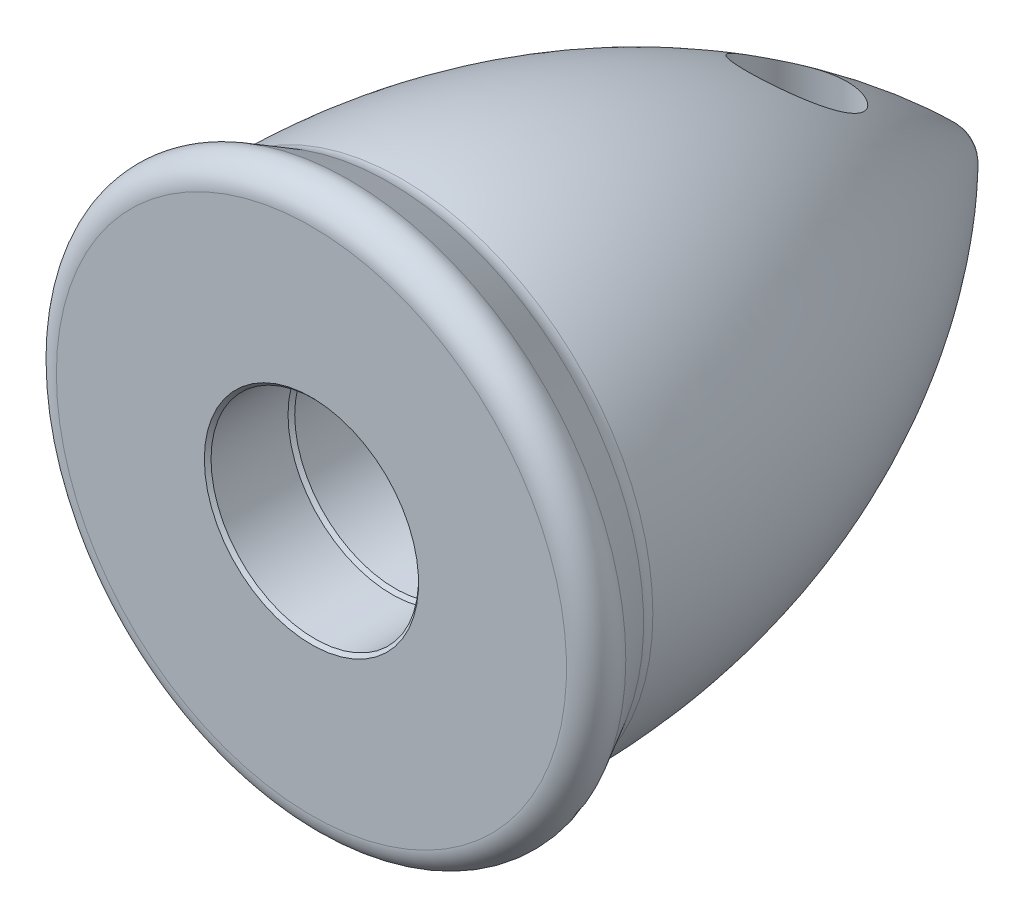
ISO-10303-21;
HEADER;
FILE_DESCRIPTION(('STEP AP214'),'2;1');
FILE_NAME('part.step','',(''),(''),'','','');
FILE_SCHEMA(('AUTOMOTIVE_DESIGN { 1 0 10303 214 1 1 1 1 }'));
ENDSEC;
DATA;
#1=APPLICATION_CONTEXT('core data for automotive mechanical design processes');
#2=APPLICATION_PROTOCOL_DEFINITION('international standard','automotive_design',2000,#1);
#3=PRODUCT_CONTEXT('',#1,'mechanical');
#4=PRODUCT('Part','Part','',(#3));
#5=PRODUCT_RELATED_PRODUCT_CATEGORY('part','',(#4));
#6=PRODUCT_DEFINITION_FORMATION('','',#4);
#7=PRODUCT_DEFINITION_CONTEXT('part definition',#1,'design');
#8=PRODUCT_DEFINITION('design','',#6,#7);
#9=PRODUCT_DEFINITION_SHAPE('','',#8);
#10=(LENGTH_UNIT() NAMED_UNIT(*) SI_UNIT(.MILLI.,.METRE.));
#11=(NAMED_UNIT(*) PLANE_ANGLE_UNIT() SI_UNIT($,.RADIAN.));
#12=(NAMED_UNIT(*) SI_UNIT($,.STERADIAN.) SOLID_ANGLE_UNIT());
#13=UNCERTAINTY_MEASURE_WITH_UNIT(LENGTH_MEASURE(1.E-05),#10,'distance_accuracy_value','');
#14=(GEOMETRIC_REPRESENTATION_CONTEXT(3) GLOBAL_UNCERTAINTY_ASSIGNED_CONTEXT((#13)) GLOBAL_UNIT_ASSIGNED_CONTEXT((#10,
#11,#12)) REPRESENTATION_CONTEXT('',''));
#15=CARTESIAN_POINT('',(0.,0.,0.));
#16=DIRECTION('',(0.,0.,1.));
#17=DIRECTION('',(1.,0.,0.));
#18=AXIS2_PLACEMENT_3D('',#15,#16,#17);
#19=CARTESIAN_POINT('',(7.50239386398377,0.,-2.29469548189932));
#20=CARTESIAN_POINT('',(7.5297305454616,0.,-5.74779549459788));
#21=CARTESIAN_POINT('',(6.1833923831177,0.,-11.7594867084584));
#22=CARTESIAN_POINT('',(2.67653979166486,0.,-16.7942215413426));
#23=CARTESIAN_POINT('',(0.7143215008139,0.,-18.7971070681359));
#24=B_SPLINE_CURVE_WITH_KNOTS('',3,(#19,#20,#21,#22,#23),.UNSPECIFIED.,.F.,.F.,(4,1,4),
(0.00980925829120195,0.525019897301883,0.949749030526497),.UNSPECIFIED.);
#25=CARTESIAN_POINT('',(0.,0.,-16.7519899261462));
#26=DIRECTION('',(0.,0.,-1.));
#27=AXIS1_PLACEMENT('',#25,#26);
#28=SURFACE_OF_REVOLUTION('',#24,#27);
#29=CARTESIAN_POINT('',(0.,0.,-18.7971070681359));
#30=DIRECTION('',(0.,0.,-1.));
#31=DIRECTION('',(-1.,0.,0.));
#32=AXIS2_PLACEMENT_3D('',#29,#30,#31);
#33=CIRCLE('',#32,0.714321500813902);
#34=CARTESIAN_POINT('',(-0.714321500813902,0.,-18.7971070681359));
#35=VERTEX_POINT('',#34);
#36=EDGE_CURVE('E52',#35,#35,#33,.T.);
#37=ORIENTED_EDGE('',*,*,#36,.F.);
#38=EDGE_LOOP('',(#37));
#39=FACE_BOUND('',#38,.T.);
#40=CARTESIAN_POINT('',(0.,0.,-2.29469548189932));
#41=DIRECTION('',(0.,0.,-1.));
#42=DIRECTION('',(-1.,0.,0.));
#43=AXIS2_PLACEMENT_3D('',#40,#41,#42);
#44=CIRCLE('',#43,7.50239386398377);
#45=CARTESIAN_POINT('',(-7.50239386398377,0.,-2.29469548189932));
#46=VERTEX_POINT('',#45);
#47=EDGE_CURVE('E11',#46,#46,#44,.T.);
#48=ORIENTED_EDGE('',*,*,#47,.T.);
#49=EDGE_LOOP('',(#48));
#50=FACE_BOUND('',#49,.T.);
#51=CARTESIAN_POINT('',(0.,-3.36683611529871,-15.5972893877669));
#52=CARTESIAN_POINT('',(0.0812272409601651,-3.36683418529455,-15.5972855620368));
#53=CARTESIAN_POINT('',(0.162550375921565,-3.36846590658514,-15.5906634564938));
#54=CARTESIAN_POINT('',(0.323019432340645,-3.37521289617,-15.5643581949395));
#55=CARTESIAN_POINT('',(0.402160903985751,-3.38033480462186,-15.5446501444629));
#56=CARTESIAN_POINT('',(0.555887105832765,-3.39465908735613,-15.4928398181126));
#57=CARTESIAN_POINT('',(0.630472857133166,-3.40386054342055,-15.4607403314935));
#58=CARTESIAN_POINT('',(0.772882458401085,-3.42709325176989,-15.3853651492674));
#59=CARTESIAN_POINT('',(0.840710646777201,-3.44112137918871,-15.3420966891527));
#60=CARTESIAN_POINT('',(0.967260164628035,-3.47450541452666,-15.2464833314251));
#61=CARTESIAN_POINT('',(1.02605003179194,-3.49381778591244,-15.1942138435054));
#62=CARTESIAN_POINT('',(1.13380288913027,-3.53804914952354,-15.0824397100203));
#63=CARTESIAN_POINT('',(1.18276467042041,-3.56296883066632,-15.0229341758432));
#64=CARTESIAN_POINT('',(1.27095105138096,-3.61868115384143,-14.8977041099588));
#65=CARTESIAN_POINT('',(1.30997078630352,-3.64957731175465,-14.8318821564998));
#66=CARTESIAN_POINT('',(1.37689927932686,-3.71620795594519,-14.6971363118445));
#67=CARTESIAN_POINT('',(1.40480332361975,-3.75194448627936,-14.6282111184247));
#68=CARTESIAN_POINT('',(1.45220607846086,-3.83133313156455,-14.481550041618));
#69=CARTESIAN_POINT('',(1.47048669816308,-3.87542305239418,-14.4036602279141));
#70=CARTESIAN_POINT('',(1.49449396126122,-3.96698573065123,-14.2479631341415));
#71=CARTESIAN_POINT('',(1.50021431061989,-4.01446017178838,-14.1701559149716));
#72=CARTESIAN_POINT('',(1.49973589985453,-4.11977607227993,-14.0027065344512));
#73=CARTESIAN_POINT('',(1.49133625746062,-4.1780040131553,-13.9133109171399));
#74=CARTESIAN_POINT('',(1.45904796325544,-4.29537958061144,-13.7379143236744));
#75=CARTESIAN_POINT('',(1.4351411335718,-4.35452820691995,-13.6519174572879));
#76=CARTESIAN_POINT('',(1.36830129598194,-4.47904620022881,-13.4745661923774));
#77=CARTESIAN_POINT('',(1.32339850886644,-4.54429137333329,-13.3838433939071));
#78=CARTESIAN_POINT('',(1.24191426663574,-4.63885556808259,-13.2545309878723));
#79=CARTESIAN_POINT('',(1.21241100033431,-4.66981582259914,-13.212569370427));
#80=CARTESIAN_POINT('',(1.14862215835048,-4.73029377008918,-13.1311926843234));
#81=CARTESIAN_POINT('',(1.11433073125292,-4.75980963741857,-13.0917808191743));
#82=CARTESIAN_POINT('',(1.02421671800585,-4.82993934844167,-12.9987078322162));
#83=CARTESIAN_POINT('',(0.965716097720881,-4.86946064794607,-12.9467658739084));
#84=CARTESIAN_POINT('',(0.838999079217955,-4.94252978294202,-12.8513564941756));
#85=CARTESIAN_POINT('',(0.770802072466016,-4.97608924702086,-12.8078725592503));
#86=CARTESIAN_POINT('',(0.637390109006207,-5.03048040389518,-12.7377114459668));
#87=CARTESIAN_POINT('',(0.573495908020763,-5.05249460600546,-12.7094507912064));
#88=CARTESIAN_POINT('',(0.44061752935313,-5.08975973634557,-12.6617303727366));
#89=CARTESIAN_POINT('',(0.371635837598982,-5.10501394254217,-12.6422663433942));
#90=CARTESIAN_POINT('',(0.229968220063427,-5.12777874095686,-12.6132525851542));
#91=CARTESIAN_POINT('',(0.157265162131024,-5.13524935241915,-12.6037540426697));
#92=CARTESIAN_POINT('',(0.010881157996371,-5.14170815273184,-12.5955406143506));
#93=CARTESIAN_POINT('',(-0.062799474423151,-5.14069900066183,-12.5968223480431));
#94=CARTESIAN_POINT('',(-0.202136393767585,-5.13075544653971,-12.6094711461916));
#95=CARTESIAN_POINT('',(-0.267928679632418,-5.12252556026103,-12.6199416933949));
#96=CARTESIAN_POINT('',(-0.396472546982742,-5.09963335861077,-12.6491335116116));
#97=CARTESIAN_POINT('',(-0.459223775702315,-5.08497029895804,-12.6678557372977));
#98=CARTESIAN_POINT('',(-0.582708946967991,-5.04936235558407,-12.713471758756));
#99=CARTESIAN_POINT('',(-0.643271711223776,-5.02819698030078,-12.7406528995982));
#100=CARTESIAN_POINT('',(-0.758782287827659,-4.98086929586297,-12.8017108180393));
#101=CARTESIAN_POINT('',(-0.813727690608846,-4.95470485605077,-12.8355904508262));
#102=CARTESIAN_POINT('',(-0.925658259684589,-4.89397422367666,-12.9146814199054));
#103=CARTESIAN_POINT('',(-0.981607410812035,-4.85873386027955,-12.9608368210213));
#104=CARTESIAN_POINT('',(-1.08503586507779,-4.78432157249232,-13.0591188366811));
#105=CARTESIAN_POINT('',(-1.13250544901166,-4.74514521601259,-13.1112521921927));
#106=CARTESIAN_POINT('',(-1.22795052232634,-4.65555114198199,-13.2317163771232));
#107=CARTESIAN_POINT('',(-1.27394086126101,-4.60449987484057,-13.3011501864998));
#108=CARTESIAN_POINT('',(-1.35340655440566,-4.50017828314449,-13.4453106143892));
#109=CARTESIAN_POINT('',(-1.38687270302636,-4.44690635818978,-13.520041078276));
#110=CARTESIAN_POINT('',(-1.4460678811299,-4.33004840960501,-13.6872893245782));
#111=CARTESIAN_POINT('',(-1.46933444239801,-4.26632537576646,-13.7805942135521));
#112=CARTESIAN_POINT('',(-1.49777248921709,-4.14027225832051,-13.9709534484073));
#113=CARTESIAN_POINT('',(-1.50292519762401,-4.07794368668011,-14.0680115796943));
#114=CARTESIAN_POINT('',(-1.49374868530631,-3.95471042865673,-14.2678435930831));
#115=CARTESIAN_POINT('',(-1.47862327080246,-3.89396522925433,-14.37068990071));
#116=CARTESIAN_POINT('',(-1.43913052995289,-3.80847646621682,-14.5235187524778));
#117=CARTESIAN_POINT('',(-1.42317627710231,-3.78092932354624,-14.5741995083119));
#118=CARTESIAN_POINT('',(-1.38550960550279,-3.72805078841556,-14.674553663076));
#119=CARTESIAN_POINT('',(-1.36379987117426,-3.70271837028919,-14.7242275200379));
#120=CARTESIAN_POINT('',(-1.30409481861067,-3.64446732670798,-14.8425262305979));
#121=CARTESIAN_POINT('',(-1.26309214677888,-3.6128518643145,-14.9103135352416));
#122=CARTESIAN_POINT('',(-1.16942899467661,-3.55562051666033,-15.0400673168667));
#123=CARTESIAN_POINT('',(-1.11677759953109,-3.52999998767151,-15.1020382768047));
#124=CARTESIAN_POINT('',(-1.00057203679875,-3.48490403069105,-15.2178241428651));
#125=CARTESIAN_POINT('',(-0.93698763063423,-3.46544608312833,-15.2716156270938));
#126=CARTESIAN_POINT('',(-0.800689845344788,-3.43240974312407,-15.368464528688));
#127=CARTESIAN_POINT('',(-0.727971144660849,-3.41883479875213,-15.4115156447932));
#128=CARTESIAN_POINT('',(-0.579547716424519,-3.39734976004411,-15.4831392965126));
#129=CARTESIAN_POINT('',(-0.504174650815422,-3.38919012393694,-15.5123286922207));
#130=CARTESIAN_POINT('',(-0.34952556142046,-3.37675813099057,-15.5582187921846));
#131=CARTESIAN_POINT('',(-0.270257451606524,-3.37247820973797,-15.5749437873306));
#132=CARTESIAN_POINT('',(-0.158674263387871,-3.36886081965983,-15.5892134767772));
#133=CARTESIAN_POINT('',(-0.127024287573077,-3.36810000848527,-15.5922392231327));
#134=CARTESIAN_POINT('',(-0.0635877747597487,-3.36708803209331,-15.5962779355057));
#135=CARTESIAN_POINT('',(-0.031801236681284,-3.36683687091368,-15.5972908855766));
#136=CARTESIAN_POINT('',(0.,-3.36683611529871,-15.5972893877669));
#137=B_SPLINE_CURVE_WITH_KNOTS('',3,(#51,#52,#53,#54,#55,#56,#57,#58,#59,#60,#61,#62,#63,#64,
#65,#66,#67,#68,#69,#70,#71,#72,#73,#74,#75,#76,#77,#78,#79,#80,#81,#82,#83,#84,#85,#86,#87,#88,
#89,#90,#91,#92,#93,#94,#95,#96,#97,#98,#99,#100,#101,#102,#103,#104,#105,#106,#107,#108,#109,
#110,#111,#112,#113,#114,#115,#116,#117,#118,#119,#120,#121,#122,#123,#124,#125,#126,#127,#128,
#129,#130,#131,#132,#133,#134,#135,#136),.UNSPECIFIED.,.T.,.F.,(4,2,2,2,2,2,2,2,2,2,2,2,2,2,2,2,
2,2,2,2,2,2,2,2,2,2,2,2,2,2,2,2,2,2,2,2,2,2,2,2,2,2,4),(0.,0.243563303916712,0.487591290904557,
0.731564380328201,0.975379813863515,1.21724399984576,1.45913791764857,1.70567331657026,
1.95231315223458,2.22533052638554,2.49848468021453,2.81825852793494,3.1384079007938,
3.49772269316163,3.67725090391433,3.85700046079829,4.11889511252797,4.38027319068593,
4.59911590574088,4.81785238608739,5.03770695788248,5.25749259037551,5.45795664682871,
5.65844390193861,5.86666453565482,6.07497411412518,6.31601442144172,6.55732925862869,
6.84929514324032,7.14147521044902,7.48603304697213,7.83094795316268,8.18980979435902,
8.36908223586731,8.54827120937681,8.80299009269337,9.05751101047158,9.31274755262736,
9.56813348906224,9.81073609628413,10.0528646690771,10.148221261502,10.2435786093962),.UNSPECIFIED.);
#138=CARTESIAN_POINT('',(0.,-3.36683611529871,-15.5972893877669));
#139=VERTEX_POINT('',#138);
#140=EDGE_CURVE('E103',#139,#139,#137,.T.);
#141=ORIENTED_EDGE('',*,*,#140,.F.);
#142=EDGE_LOOP('',(#141));
#143=FACE_BOUND('',#142,.T.);
#144=CARTESIAN_POINT('',(0.,3.36683611529871,-15.5972893877669));
#145=CARTESIAN_POINT('',(-0.0812272409601656,3.36683418529455,-15.5972855620368));
#146=CARTESIAN_POINT('',(-0.162550375921565,3.36846590658514,-15.5906634564937));
#147=CARTESIAN_POINT('',(-0.323019432340645,3.37521289617,-15.5643581949395));
#148=CARTESIAN_POINT('',(-0.402160903985752,3.38033480462186,-15.5446501444629));
#149=CARTESIAN_POINT('',(-0.555887105832766,3.39465908735613,-15.4928398181126));
#150=CARTESIAN_POINT('',(-0.630472857133166,3.40386054342055,-15.4607403314935));
#151=CARTESIAN_POINT('',(-0.772882458401085,3.42709325176989,-15.3853651492674));
#152=CARTESIAN_POINT('',(-0.840710646777199,3.44112137918871,-15.3420966891527));
#153=CARTESIAN_POINT('',(-0.967260164628033,3.47450541452666,-15.2464833314251));
#154=CARTESIAN_POINT('',(-1.02605003179194,3.49381778591244,-15.1942138435054));
#155=CARTESIAN_POINT('',(-1.13380288913027,3.53804914952354,-15.0824397100203));
#156=CARTESIAN_POINT('',(-1.18276467042041,3.56296883066632,-15.0229341758432));
#157=CARTESIAN_POINT('',(-1.27095105138096,3.61868115384143,-14.8977041099588));
#158=CARTESIAN_POINT('',(-1.30997078630352,3.64957731175465,-14.8318821564998));
#159=CARTESIAN_POINT('',(-1.37689927932686,3.71620795594519,-14.6971363118445));
#160=CARTESIAN_POINT('',(-1.40480332361975,3.75194448627936,-14.6282111184247));
#161=CARTESIAN_POINT('',(-1.45220607846087,3.83133313156455,-14.481550041618));
#162=CARTESIAN_POINT('',(-1.47048669816308,3.87542305239418,-14.4036602279141));
#163=CARTESIAN_POINT('',(-1.49449396126122,3.96698573065122,-14.2479631341415));
#164=CARTESIAN_POINT('',(-1.50021431061989,4.01446017178838,-14.1701559149716));
#165=CARTESIAN_POINT('',(-1.49973589985453,4.11977607227994,-14.0027065344512));
#166=CARTESIAN_POINT('',(-1.49133625746062,4.1780040131553,-13.9133109171399));
#167=CARTESIAN_POINT('',(-1.45904796325544,4.29537958061144,-13.7379143236744));
#168=CARTESIAN_POINT('',(-1.4351411335718,4.35452820691995,-13.6519174572879));
#169=CARTESIAN_POINT('',(-1.36830129598194,4.47904620022881,-13.4745661923774));
#170=CARTESIAN_POINT('',(-1.32339850886644,4.54429137333329,-13.3838433939071));
#171=CARTESIAN_POINT('',(-1.24191426663574,4.63885556808259,-13.2545309878723));
#172=CARTESIAN_POINT('',(-1.2124110003343,4.66981582259914,-13.212569370427));
#173=CARTESIAN_POINT('',(-1.14862215835048,4.73029377008918,-13.1311926843234));
#174=CARTESIAN_POINT('',(-1.11433073125292,4.75980963741858,-13.0917808191743));
#175=CARTESIAN_POINT('',(-1.02421671800585,4.82993934844168,-12.9987078322162));
#176=CARTESIAN_POINT('',(-0.965716097720878,4.86946064794607,-12.9467658739084));
#177=CARTESIAN_POINT('',(-0.838999079217952,4.94252978294202,-12.8513564941756));
#178=CARTESIAN_POINT('',(-0.770802072466011,4.97608924702086,-12.8078725592503));
#179=CARTESIAN_POINT('',(-0.637390109006202,5.03048040389518,-12.7377114459668));
#180=CARTESIAN_POINT('',(-0.573495908020758,5.05249460600546,-12.7094507912064));
#181=CARTESIAN_POINT('',(-0.440617529353126,5.08975973634557,-12.6617303727366));
#182=CARTESIAN_POINT('',(-0.371635837598978,5.10501394254217,-12.6422663433942));
#183=CARTESIAN_POINT('',(-0.229968220063424,5.12777874095686,-12.6132525851542));
#184=CARTESIAN_POINT('',(-0.15726516213102,5.13524935241915,-12.6037540426697));
#185=CARTESIAN_POINT('',(-0.0108811579963681,5.14170815273184,-12.5955406143506));
#186=CARTESIAN_POINT('',(0.0627994744231537,5.14069900066183,-12.5968223480431));
#187=CARTESIAN_POINT('',(0.202136393767588,5.13075544653971,-12.6094711461916));
#188=CARTESIAN_POINT('',(0.267928679632421,5.12252556026103,-12.6199416933949));
#189=CARTESIAN_POINT('',(0.396472546982745,5.09963335861077,-12.6491335116116));
#190=CARTESIAN_POINT('',(0.459223775702317,5.08497029895803,-12.6678557372977));
#191=CARTESIAN_POINT('',(0.582708946967992,5.04936235558406,-12.713471758756));
#192=CARTESIAN_POINT('',(0.643271711223778,5.02819698030077,-12.7406528995982));
#193=CARTESIAN_POINT('',(0.75878228782766,4.98086929586297,-12.8017108180394));
#194=CARTESIAN_POINT('',(0.813727690608846,4.95470485605077,-12.8355904508262));
#195=CARTESIAN_POINT('',(0.925658259684589,4.89397422367666,-12.9146814199054));
#196=CARTESIAN_POINT('',(0.981607410812036,4.85873386027955,-12.9608368210213));
#197=CARTESIAN_POINT('',(1.08503586507779,4.78432157249232,-13.0591188366811));
#198=CARTESIAN_POINT('',(1.13250544901166,4.74514521601259,-13.1112521921927));
#199=CARTESIAN_POINT('',(1.22795052232634,4.65555114198198,-13.2317163771232));
#200=CARTESIAN_POINT('',(1.27394086126101,4.60449987484057,-13.3011501864998));
#201=CARTESIAN_POINT('',(1.35340655440566,4.50017828314449,-13.4453106143892));
#202=CARTESIAN_POINT('',(1.38687270302637,4.44690635818978,-13.520041078276));
#203=CARTESIAN_POINT('',(1.4460678811299,4.33004840960501,-13.6872893245782));
#204=CARTESIAN_POINT('',(1.46933444239801,4.26632537576646,-13.7805942135521));
#205=CARTESIAN_POINT('',(1.49777248921709,4.1402722583205,-13.9709534484073));
#206=CARTESIAN_POINT('',(1.50292519762401,4.07794368668011,-14.0680115796943));
#207=CARTESIAN_POINT('',(1.49374868530631,3.95471042865673,-14.2678435930831));
#208=CARTESIAN_POINT('',(1.47862327080246,3.89396522925433,-14.37068990071));
#209=CARTESIAN_POINT('',(1.43913052995289,3.80847646621681,-14.5235187524778));
#210=CARTESIAN_POINT('',(1.42317627710231,3.78092932354624,-14.5741995083119));
#211=CARTESIAN_POINT('',(1.38550960550279,3.72805078841556,-14.674553663076));
#212=CARTESIAN_POINT('',(1.36379987117426,3.70271837028919,-14.7242275200379));
#213=CARTESIAN_POINT('',(1.30409481861067,3.64446732670798,-14.8425262305979));
#214=CARTESIAN_POINT('',(1.26309214677888,3.61285186431449,-14.9103135352416));
#215=CARTESIAN_POINT('',(1.16942899467661,3.55562051666033,-15.0400673168667));
#216=CARTESIAN_POINT('',(1.11677759953109,3.52999998767151,-15.1020382768047));
#217=CARTESIAN_POINT('',(1.00057203679875,3.48490403069105,-15.2178241428651));
#218=CARTESIAN_POINT('',(0.936987630634229,3.46544608312832,-15.2716156270938));
#219=CARTESIAN_POINT('',(0.800689845344785,3.43240974312407,-15.368464528688));
#220=CARTESIAN_POINT('',(0.727971144660847,3.41883479875213,-15.4115156447932));
#221=CARTESIAN_POINT('',(0.579547716424517,3.39734976004411,-15.4831392965126));
#222=CARTESIAN_POINT('',(0.504174650815419,3.38919012393694,-15.5123286922207));
#223=CARTESIAN_POINT('',(0.349525561420456,3.37675813099057,-15.5582187921846));
#224=CARTESIAN_POINT('',(0.27025745160652,3.37247820973797,-15.5749437873306));
#225=CARTESIAN_POINT('',(0.158674263387867,3.36886081965983,-15.5892134767772));
#226=CARTESIAN_POINT('',(0.127024287573074,3.36810000848527,-15.5922392231327));
#227=CARTESIAN_POINT('',(0.0635877747597471,3.36708803209331,-15.5962779355057));
#228=CARTESIAN_POINT('',(0.031801236681283,3.36683687091368,-15.5972908855766));
#229=CARTESIAN_POINT('',(0.,3.36683611529871,-15.5972893877669));
#230=B_SPLINE_CURVE_WITH_KNOTS('',3,(#144,#145,#146,#147,#148,#149,#150,#151,#152,#153,#154,
#155,#156,#157,#158,#159,#160,#161,#162,#163,#164,#165,#166,#167,#168,#169,#170,#171,#172,#173,
#174,#175,#176,#177,#178,#179,#180,#181,#182,#183,#184,#185,#186,#187,#188,#189,#190,#191,#192,
#193,#194,#195,#196,#197,#198,#199,#200,#201,#202,#203,#204,#205,#206,#207,#208,#209,#210,#211,
#212,#213,#214,#215,#216,#217,#218,#219,#220,#221,#222,#223,#224,#225,#226,#227,#228,#229),
.UNSPECIFIED.,.T.,.F.,(4,2,2,2,2,2,2,2,2,2,2,2,2,2,2,2,2,2,2,2,2,2,2,2,2,2,2,2,2,2,2,2,2,2,2,2,
2,2,2,2,2,2,4),(0.,0.243563303916713,0.487591290904558,0.731564380328201,0.975379813863514,
1.21724399984576,1.45913791764857,1.70567331657026,1.95231315223458,2.22533052638554,
2.49848468021453,2.81825852793494,3.1384079007938,3.49772269316163,3.67725090391433,
3.85700046079829,4.11889511252798,4.38027319068594,4.59911590574089,4.8178523860874,
5.03770695788248,5.25749259037551,5.45795664682871,5.65844390193861,5.86666453565482,
6.07497411412518,6.31601442144172,6.55732925862869,6.84929514324033,7.14147521044902,
7.48603304697213,7.83094795316269,8.18980979435902,8.36908223586732,8.54827120937681,
8.80299009269337,9.05751101047159,9.31274755262737,9.56813348906225,9.81073609628414,
10.0528646690771,10.148221261502,10.2435786093962),.UNSPECIFIED.);
#231=CARTESIAN_POINT('',(0.,3.36683611529871,-15.5972893877669));
#232=VERTEX_POINT('',#231);
#233=EDGE_CURVE('E108',#232,#232,#230,.T.);
#234=ORIENTED_EDGE('',*,*,#233,.F.);
#235=EDGE_LOOP('',(#234));
#236=FACE_BOUND('',#235,.T.);
#237=ADVANCED_FACE('F38',(#39,#50,#143,#236),#28,.T.);
#238=CARTESIAN_POINT('',(0.,0.,-16.7519899261462));
#239=DIRECTION('',(0.,0.,-1.));
#240=DIRECTION('',(-1.,0.,0.));
#241=AXIS2_PLACEMENT_3D('',#238,#239,#240);
#242=CYLINDRICAL_SURFACE('',#241,2.);
#243=CARTESIAN_POINT('',(0.,0.,-12.3472893803076));
#244=DIRECTION('',(0.,0.,-1.));
#245=DIRECTION('',(-1.,0.,0.));
#246=AXIS2_PLACEMENT_3D('',#243,#244,#245);
#247=CIRCLE('',#246,2.);
#248=CARTESIAN_POINT('',(-2.,0.,-12.3472893803076));
#249=VERTEX_POINT('',#248);
#250=EDGE_CURVE('E82',#249,#249,#247,.T.);
#251=ORIENTED_EDGE('',*,*,#250,.F.);
#252=EDGE_LOOP('',(#251));
#253=FACE_BOUND('',#252,.T.);
#254=CARTESIAN_POINT('',(0.,0.,-15.5972893877669));
#255=DIRECTION('',(0.,0.,-1.));
#256=DIRECTION('',(-1.,0.,0.));
#257=AXIS2_PLACEMENT_3D('',#254,#255,#256);
#258=CIRCLE('',#257,1.99999999999999);
#259=CARTESIAN_POINT('',(0.,1.99999999999999,-15.5972893877669));
#260=VERTEX_POINT('',#259);
#261=CARTESIAN_POINT('',(0.,-1.99999999999999,-15.5972893877669));
#262=VERTEX_POINT('',#261);
#263=EDGE_CURVE('E75',#260,#262,#258,.T.);
#264=ORIENTED_EDGE('',*,*,#263,.T.);
#265=CARTESIAN_POINT('',(0.,-2.,-15.5972893877669));
#266=CARTESIAN_POINT('',(-0.0732207360514959,-1.99999540196351,-15.5972845957545));
#267=CARTESIAN_POINT('',(-0.146561062435543,-1.99593645523975,-15.5918843633816));
#268=CARTESIAN_POINT('',(-0.290936397093602,-1.98006607269944,-15.5706223243068));
#269=CARTESIAN_POINT('',(-0.36196513722581,-1.96823514662221,-15.5547342160394));
#270=CARTESIAN_POINT('',(-0.499234627993681,-1.93795674921678,-15.5135764783383));
#271=CARTESIAN_POINT('',(-0.565501616942086,-1.91954951887376,-15.4883638740128));
#272=CARTESIAN_POINT('',(-0.692422337398128,-1.87750556653166,-15.4297470433066));
#273=CARTESIAN_POINT('',(-0.753077703836611,-1.85387037453294,-15.3963452132519));
#274=CARTESIAN_POINT('',(-0.873465939966079,-1.80049544429612,-15.3190263757447));
#275=CARTESIAN_POINT('',(-0.932593231818152,-1.77039308415189,-15.2744220579384));
#276=CARTESIAN_POINT('',(-1.04302717054794,-1.70767017708909,-15.1777935497861));
#277=CARTESIAN_POINT('',(-1.09432148574852,-1.675045778818,-15.1257579042854));
#278=CARTESIAN_POINT('',(-1.1983716177963,-1.60271123397245,-15.0037064335921));
#279=CARTESIAN_POINT('',(-1.24930578787502,-1.56290854573434,-14.9321857095847));
#280=CARTESIAN_POINT('',(-1.33861998587136,-1.48711444295986,-14.7798383739831));
#281=CARTESIAN_POINT('',(-1.37701717415035,-1.45111786475057,-14.6990246891564));
#282=CARTESIAN_POINT('',(-1.42880628272507,-1.3997715471034,-14.5577865472476));
#283=CARTESIAN_POINT('',(-1.44625674926785,-1.38157750694826,-14.4998986887841));
#284=CARTESIAN_POINT('',(-1.47420673056716,-1.3517159361459,-14.3808966510757));
#285=CARTESIAN_POINT('',(-1.4847221585924,-1.34003347352608,-14.3197902079455));
#286=CARTESIAN_POINT('',(-1.49812822671563,-1.3250375908538,-14.1951068001479));
#287=CARTESIAN_POINT('',(-1.50094955398215,-1.3218002605882,-14.1315125788526));
#288=CARTESIAN_POINT('',(-1.49848213813394,-1.32459531129495,-14.0046744744541));
#289=CARTESIAN_POINT('',(-1.49319048742527,-1.33063101561322,-13.9414307251092));
#290=CARTESIAN_POINT('',(-1.47597739904417,-1.3496762259252,-13.8240980376526));
#291=CARTESIAN_POINT('',(-1.46482487008845,-1.3618715638415,-13.7697530140484));
#292=CARTESIAN_POINT('',(-1.43705671782273,-1.39114192161357,-13.6638505063882));
#293=CARTESIAN_POINT('',(-1.42043584360726,-1.40822162955057,-13.6122957572837));
#294=CARTESIAN_POINT('',(-1.37033064893922,-1.45741768615694,-13.4810329982162));
#295=CARTESIAN_POINT('',(-1.33280149237578,-1.49225648474876,-13.4038889679608));
#296=CARTESIAN_POINT('',(-1.24618024102992,-1.56533297517298,-13.2580928602251));
#297=CARTESIAN_POINT('',(-1.19706005066996,-1.6035787828044,-13.1894620445756));
#298=CARTESIAN_POINT('',(-1.08651604953994,-1.68051671762476,-13.0595359927847));
#299=CARTESIAN_POINT('',(-1.02481376394908,-1.71919586212449,-12.9984687759366));
#300=CARTESIAN_POINT('',(-0.890422530703158,-1.79248037534386,-12.887025735244));
#301=CARTESIAN_POINT('',(-0.81775506342194,-1.82709347855481,-12.8366294613724));
#302=CARTESIAN_POINT('',(-0.677902089594456,-1.88279725745345,-12.7573085814477));
#303=CARTESIAN_POINT('',(-0.612539879198703,-1.90520770656247,-12.7261047860135));
#304=CARTESIAN_POINT('',(-0.476352181865195,-1.94372904205636,-12.6730644988619));
#305=CARTESIAN_POINT('',(-0.405530149504153,-1.95984387330951,-12.6512221403817));
#306=CARTESIAN_POINT('',(-0.259676240363054,-1.98445588534154,-12.618036015139));
#307=CARTESIAN_POINT('',(-0.184621288946216,-1.99290592903439,-12.6067571986776));
#308=CARTESIAN_POINT('',(-0.0332012465653224,-2.00115883649719,-12.5957397795014));
#309=CARTESIAN_POINT('',(0.0431632780368474,-2.00096534860769,-12.5959963078436));
#310=CARTESIAN_POINT('',(0.186804211708829,-1.99242547229404,-12.6074002452588));
#311=CARTESIAN_POINT('',(0.2542223222051,-1.98490086669731,-12.6174499126234));
#312=CARTESIAN_POINT('',(0.386110665862443,-1.96351320295854,-12.6462631552859));
#313=CARTESIAN_POINT('',(0.450580268555205,-1.94964879610666,-12.6650285847617));
#314=CARTESIAN_POINT('',(0.577416775761677,-1.91599830802223,-12.7111769052377));
#315=CARTESIAN_POINT('',(0.639629168808676,-1.89602050416557,-12.7388405558322));
#316=CARTESIAN_POINT('',(0.758518523744002,-1.85166985547736,-12.8014618293599));
#317=CARTESIAN_POINT('',(0.815194718265086,-1.82729640269796,-12.8364204613434));
#318=CARTESIAN_POINT('',(0.931511623727946,-1.77119147023623,-12.9190726195926));
#319=CARTESIAN_POINT('',(0.990066760368489,-1.73891095158743,-12.9679179123242));
#320=CARTESIAN_POINT('',(1.09871974678731,-1.67238952992215,-13.073298124864));
#321=CARTESIAN_POINT('',(1.14879830322321,-1.63814438611957,-13.1298500716527));
#322=CARTESIAN_POINT('',(1.2487754101232,-1.56369128344683,-13.2614392523588));
#323=CARTESIAN_POINT('',(1.29683043637774,-1.5235871853229,-13.3379469326613));
#324=CARTESIAN_POINT('',(1.37923236100042,-1.44940591254503,-13.5006494487017));
#325=CARTESIAN_POINT('',(1.41362000677331,-1.41531099412056,-13.5868144924285));
#326=CARTESIAN_POINT('',(1.45615734527796,-1.37118877521897,-13.7327038192478));
#327=CARTESIAN_POINT('',(1.46931009828387,-1.35695811483833,-13.7896804968012));
#328=CARTESIAN_POINT('',(1.48891522587749,-1.33542055651291,-13.9059964175384));
#329=CARTESIAN_POINT('',(1.49538255651204,-1.32809820711538,-13.9653300774881));
#330=CARTESIAN_POINT('',(1.50115320752019,-1.3215760117574,-14.0851184509262));
#331=CARTESIAN_POINT('',(1.5004201591269,-1.32241740018182,-14.1455773144241));
#332=CARTESIAN_POINT('',(1.49176884508239,-1.3321644779309,-14.2653462108595));
#333=CARTESIAN_POINT('',(1.4838413073276,-1.34108057373421,-14.324654660398));
#334=CARTESIAN_POINT('',(1.4589384262121,-1.36817347942002,-14.453203943955));
#335=CARTESIAN_POINT('',(1.44036568820954,-1.38794705049235,-14.5217865523833));
#336=CARTESIAN_POINT('',(1.39469628274757,-1.43382962402506,-14.6538242206115));
#337=CARTESIAN_POINT('',(1.36757808382822,-1.45995459128206,-14.7172658136435));
#338=CARTESIAN_POINT('',(1.29498920171931,-1.52516476275324,-14.8598100025841));
#339=CARTESIAN_POINT('',(1.24641543372491,-1.56560202149152,-14.9367109554733));
#340=CARTESIAN_POINT('',(1.13650719906925,-1.64713509185366,-15.0804154189961));
#341=CARTESIAN_POINT('',(1.07516136265706,-1.68823145992842,-15.1472098406438));
#342=CARTESIAN_POINT('',(0.939627161207347,-1.76728988073811,-15.2701212185663));
#343=CARTESIAN_POINT('',(0.865337178350281,-1.80522332905606,-15.3261456965478));
#344=CARTESIAN_POINT('',(0.705159116634109,-1.87357289001366,-15.4245124302357));
#345=CARTESIAN_POINT('',(0.619299438492493,-1.90400691004403,-15.4668873546945));
#346=CARTESIAN_POINT('',(0.464840308798296,-1.94636704183889,-15.5250888030374));
#347=CARTESIAN_POINT('',(0.39855363322878,-1.9611032212532,-15.5450561142744));
#348=CARTESIAN_POINT('',(0.262841628693565,-1.98383739728415,-15.5757072872178));
#349=CARTESIAN_POINT('',(0.19342564197046,-1.99185421035825,-15.5864170757169));
#350=CARTESIAN_POINT('',(0.102963324783942,-1.99745471632464,-15.5938940810084));
#351=CARTESIAN_POINT('',(0.0824069579467667,-1.99840761385866,-15.5951656646477));
#352=CARTESIAN_POINT('',(0.0412368956139289,-1.99968095413864,-15.5968640608759));
#353=CARTESIAN_POINT('',(0.0206231914242516,-2.00000129507283,-15.5972907374746));
#354=CARTESIAN_POINT('',(0.,-2.,-15.5972893877669));
#355=B_SPLINE_CURVE_WITH_KNOTS('',3,(#265,#266,#267,#268,#269,#270,#271,#272,#273,#274,#275,
#276,#277,#278,#279,#280,#281,#282,#283,#284,#285,#286,#287,#288,#289,#290,#291,#292,#293,#294,
#295,#296,#297,#298,#299,#300,#301,#302,#303,#304,#305,#306,#307,#308,#309,#310,#311,#312,#313,
#314,#315,#316,#317,#318,#319,#320,#321,#322,#323,#324,#325,#326,#327,#328,#329,#330,#331,#332,
#333,#334,#335,#336,#337,#338,#339,#340,#341,#342,#343,#344,#345,#346,#347,#348,#349,#350,#351,
#352,#353,#354),.UNSPECIFIED.,.T.,.F.,(4,2,2,2,2,2,2,2,2,2,2,2,2,2,2,2,2,2,2,2,2,2,2,2,2,2,2,2,
2,2,2,2,2,2,2,2,2,2,2,2,2,2,2,2,4),(0.,0.219571787190483,0.439696320633084,0.658496335377379,
0.877232401255413,1.11622431627578,1.35558868784594,1.64360016385477,1.93121574673732,
2.11999519177606,2.30833993873159,2.4983758833362,2.68847995046463,2.85826890891462,
3.02822138312129,3.30449332567472,3.58144193170163,3.86535884829288,4.14872663464139,
4.37526506101135,4.60166130862246,4.82944059514133,5.05712373941289,5.26191188552289,
5.4667436179163,5.67880441107782,5.89089455619981,6.13840383731587,6.3864691064109,
6.68168597746156,6.97601597659885,7.15589163308162,7.33536401073721,7.51574335898566,
7.69635550690954,7.91639672920148,8.13699686932824,8.43412248505376,8.73151374299481,
9.03135451505273,9.33047222389634,9.54195699767462,9.75284754619956,9.81468170113163,
9.87652580763459),.UNSPECIFIED.);
#356=EDGE_CURVE('E42',#262,#262,#355,.T.);
#357=ORIENTED_EDGE('',*,*,#356,.F.);
#358=EDGE_CURVE('E77',#262,#260,#258,.T.);
#359=ORIENTED_EDGE('',*,*,#358,.T.);
#360=CARTESIAN_POINT('',(0.,2.,-15.5972893877669));
#361=CARTESIAN_POINT('',(0.0732207360514959,1.99999540196351,-15.5972845957545));
#362=CARTESIAN_POINT('',(0.146561062435543,1.99593645523975,-15.5918843633816));
#363=CARTESIAN_POINT('',(0.290936397093602,1.98006607269944,-15.5706223243068));
#364=CARTESIAN_POINT('',(0.36196513722581,1.96823514662221,-15.5547342160394));
#365=CARTESIAN_POINT('',(0.499234627993681,1.93795674921678,-15.5135764783383));
#366=CARTESIAN_POINT('',(0.565501616942086,1.91954951887376,-15.4883638740128));
#367=CARTESIAN_POINT('',(0.692422337398128,1.87750556653166,-15.4297470433066));
#368=CARTESIAN_POINT('',(0.753077703836611,1.85387037453294,-15.3963452132519));
#369=CARTESIAN_POINT('',(0.873465939966079,1.80049544429612,-15.3190263757447));
#370=CARTESIAN_POINT('',(0.932593231818152,1.77039308415189,-15.2744220579384));
#371=CARTESIAN_POINT('',(1.04302717054794,1.70767017708909,-15.1777935497861));
#372=CARTESIAN_POINT('',(1.09432148574852,1.675045778818,-15.1257579042854));
#373=CARTESIAN_POINT('',(1.1983716177963,1.60271123397245,-15.0037064335921));
#374=CARTESIAN_POINT('',(1.24930578787502,1.56290854573434,-14.9321857095847));
#375=CARTESIAN_POINT('',(1.33861998587136,1.48711444295986,-14.7798383739831));
#376=CARTESIAN_POINT('',(1.37701717415035,1.45111786475057,-14.6990246891564));
#377=CARTESIAN_POINT('',(1.42880628272507,1.3997715471034,-14.5577865472476));
#378=CARTESIAN_POINT('',(1.44625674926785,1.38157750694826,-14.4998986887841));
#379=CARTESIAN_POINT('',(1.47420673056716,1.3517159361459,-14.3808966510757));
#380=CARTESIAN_POINT('',(1.4847221585924,1.34003347352608,-14.3197902079455));
#381=CARTESIAN_POINT('',(1.49812822671563,1.3250375908538,-14.1951068001479));
#382=CARTESIAN_POINT('',(1.50094955398215,1.3218002605882,-14.1315125788526));
#383=CARTESIAN_POINT('',(1.49848213813394,1.32459531129495,-14.0046744744541));
#384=CARTESIAN_POINT('',(1.49319048742527,1.33063101561322,-13.9414307251092));
#385=CARTESIAN_POINT('',(1.47597739904417,1.3496762259252,-13.8240980376526));
#386=CARTESIAN_POINT('',(1.46482487008845,1.3618715638415,-13.7697530140484));
#387=CARTESIAN_POINT('',(1.43705671782273,1.39114192161357,-13.6638505063882));
#388=CARTESIAN_POINT('',(1.42043584360726,1.40822162955057,-13.6122957572837));
#389=CARTESIAN_POINT('',(1.37033064893922,1.45741768615694,-13.4810329982162));
#390=CARTESIAN_POINT('',(1.33280149237578,1.49225648474876,-13.4038889679608));
#391=CARTESIAN_POINT('',(1.24618024102992,1.56533297517298,-13.2580928602251));
#392=CARTESIAN_POINT('',(1.19706005066996,1.6035787828044,-13.1894620445756));
#393=CARTESIAN_POINT('',(1.08651604953994,1.68051671762476,-13.0595359927847));
#394=CARTESIAN_POINT('',(1.02481376394908,1.71919586212449,-12.9984687759366));
#395=CARTESIAN_POINT('',(0.890422530703158,1.79248037534386,-12.887025735244));
#396=CARTESIAN_POINT('',(0.81775506342194,1.82709347855481,-12.8366294613724));
#397=CARTESIAN_POINT('',(0.677902089594456,1.88279725745345,-12.7573085814477));
#398=CARTESIAN_POINT('',(0.612539879198703,1.90520770656247,-12.7261047860135));
#399=CARTESIAN_POINT('',(0.476352181865195,1.94372904205636,-12.6730644988619));
#400=CARTESIAN_POINT('',(0.405530149504153,1.95984387330951,-12.6512221403817));
#401=CARTESIAN_POINT('',(0.259676240363054,1.98445588534154,-12.618036015139));
#402=CARTESIAN_POINT('',(0.184621288946216,1.99290592903439,-12.6067571986776));
#403=CARTESIAN_POINT('',(0.0332012465653224,2.00115883649719,-12.5957397795014));
#404=CARTESIAN_POINT('',(-0.0431632780368474,2.00096534860769,-12.5959963078436));
#405=CARTESIAN_POINT('',(-0.186804211708829,1.99242547229404,-12.6074002452588));
#406=CARTESIAN_POINT('',(-0.2542223222051,1.98490086669731,-12.6174499126234));
#407=CARTESIAN_POINT('',(-0.386110665862443,1.96351320295854,-12.6462631552859));
#408=CARTESIAN_POINT('',(-0.450580268555205,1.94964879610666,-12.6650285847617));
#409=CARTESIAN_POINT('',(-0.577416775761677,1.91599830802223,-12.7111769052377));
#410=CARTESIAN_POINT('',(-0.639629168808676,1.89602050416557,-12.7388405558322));
#411=CARTESIAN_POINT('',(-0.758518523744002,1.85166985547736,-12.8014618293599));
#412=CARTESIAN_POINT('',(-0.815194718265086,1.82729640269796,-12.8364204613434));
#413=CARTESIAN_POINT('',(-0.931511623727946,1.77119147023623,-12.9190726195926));
#414=CARTESIAN_POINT('',(-0.990066760368489,1.73891095158743,-12.9679179123242));
#415=CARTESIAN_POINT('',(-1.09871974678731,1.67238952992215,-13.073298124864));
#416=CARTESIAN_POINT('',(-1.14879830322321,1.63814438611957,-13.1298500716527));
#417=CARTESIAN_POINT('',(-1.2487754101232,1.56369128344683,-13.2614392523588));
#418=CARTESIAN_POINT('',(-1.29683043637774,1.5235871853229,-13.3379469326613));
#419=CARTESIAN_POINT('',(-1.37923236100042,1.44940591254503,-13.5006494487017));
#420=CARTESIAN_POINT('',(-1.41362000677331,1.41531099412056,-13.5868144924285));
#421=CARTESIAN_POINT('',(-1.45615734527796,1.37118877521897,-13.7327038192478));
#422=CARTESIAN_POINT('',(-1.46931009828387,1.35695811483833,-13.7896804968012));
#423=CARTESIAN_POINT('',(-1.48891522587749,1.33542055651291,-13.9059964175384));
#424=CARTESIAN_POINT('',(-1.49538255651204,1.32809820711538,-13.9653300774881));
#425=CARTESIAN_POINT('',(-1.50115320752019,1.3215760117574,-14.0851184509262));
#426=CARTESIAN_POINT('',(-1.5004201591269,1.32241740018182,-14.1455773144241));
#427=CARTESIAN_POINT('',(-1.49176884508239,1.3321644779309,-14.2653462108595));
#428=CARTESIAN_POINT('',(-1.4838413073276,1.34108057373421,-14.324654660398));
#429=CARTESIAN_POINT('',(-1.4589384262121,1.36817347942002,-14.453203943955));
#430=CARTESIAN_POINT('',(-1.44036568820954,1.38794705049235,-14.5217865523833));
#431=CARTESIAN_POINT('',(-1.39469628274757,1.43382962402506,-14.6538242206115));
#432=CARTESIAN_POINT('',(-1.36757808382822,1.45995459128206,-14.7172658136435));
#433=CARTESIAN_POINT('',(-1.29498920171931,1.52516476275324,-14.8598100025841));
#434=CARTESIAN_POINT('',(-1.24641543372491,1.56560202149152,-14.9367109554733));
#435=CARTESIAN_POINT('',(-1.13650719906925,1.64713509185366,-15.0804154189961));
#436=CARTESIAN_POINT('',(-1.07516136265706,1.68823145992842,-15.1472098406438));
#437=CARTESIAN_POINT('',(-0.939627161207347,1.76728988073811,-15.2701212185663));
#438=CARTESIAN_POINT('',(-0.865337178350281,1.80522332905606,-15.3261456965478));
#439=CARTESIAN_POINT('',(-0.705159116634109,1.87357289001366,-15.4245124302357));
#440=CARTESIAN_POINT('',(-0.619299438492493,1.90400691004403,-15.4668873546945));
#441=CARTESIAN_POINT('',(-0.464840308798296,1.94636704183889,-15.5250888030374));
#442=CARTESIAN_POINT('',(-0.39855363322878,1.9611032212532,-15.5450561142744));
#443=CARTESIAN_POINT('',(-0.262841628693565,1.98383739728415,-15.5757072872178));
#444=CARTESIAN_POINT('',(-0.19342564197046,1.99185421035825,-15.5864170757169));
#445=CARTESIAN_POINT('',(-0.102963324783942,1.99745471632464,-15.5938940810084));
#446=CARTESIAN_POINT('',(-0.0824069579467667,1.99840761385866,-15.5951656646477));
#447=CARTESIAN_POINT('',(-0.0412368956139289,1.99968095413864,-15.5968640608759));
#448=CARTESIAN_POINT('',(-0.0206231914242516,2.00000129507283,-15.5972907374746));
#449=CARTESIAN_POINT('',(0.,2.,-15.5972893877669));
#450=B_SPLINE_CURVE_WITH_KNOTS('',3,(#360,#361,#362,#363,#364,#365,#366,#367,#368,#369,#370,
#371,#372,#373,#374,#375,#376,#377,#378,#379,#380,#381,#382,#383,#384,#385,#386,#387,#388,#389,
#390,#391,#392,#393,#394,#395,#396,#397,#398,#399,#400,#401,#402,#403,#404,#405,#406,#407,#408,
#409,#410,#411,#412,#413,#414,#415,#416,#417,#418,#419,#420,#421,#422,#423,#424,#425,#426,#427,
#428,#429,#430,#431,#432,#433,#434,#435,#436,#437,#438,#439,#440,#441,#442,#443,#444,#445,#446,
#447,#448,#449),.UNSPECIFIED.,.T.,.F.,(4,2,2,2,2,2,2,2,2,2,2,2,2,2,2,2,2,2,2,2,2,2,2,2,2,2,2,2,
2,2,2,2,2,2,2,2,2,2,2,2,2,2,2,2,4),(0.,0.219571787190483,0.439696320633084,0.658496335377379,
0.877232401255413,1.11622431627578,1.35558868784594,1.64360016385477,1.93121574673732,
2.11999519177606,2.30833993873159,2.4983758833362,2.68847995046463,2.85826890891462,
3.02822138312129,3.30449332567472,3.58144193170163,3.86535884829288,4.14872663464139,
4.37526506101135,4.60166130862246,4.82944059514133,5.05712373941289,5.26191188552289,
5.4667436179163,5.67880441107782,5.89089455619981,6.13840383731587,6.3864691064109,
6.68168597746156,6.97601597659885,7.15589163308162,7.33536401073721,7.51574335898566,
7.69635550690954,7.91639672920148,8.13699686932824,8.43412248505376,8.73151374299481,
9.03135451505273,9.33047222389634,9.54195699767462,9.75284754619956,9.81468170113163,
9.87652580763459),.UNSPECIFIED.);
#451=EDGE_CURVE('E62',#260,#260,#450,.T.);
#452=ORIENTED_EDGE('',*,*,#451,.F.);
#453=EDGE_LOOP('',(#264,#357,#359,#452));
#454=FACE_BOUND('',#453,.T.);
#455=ADVANCED_FACE('F88',(#253,#454),#242,.F.);
#456=CARTESIAN_POINT('',(0.,0.,-2.28875824619899));
#457=DIRECTION('',(0.,0.,-1.));
#458=DIRECTION('',(-1.,0.,0.));
#459=AXIS2_PLACEMENT_3D('',#456,#457,#458);
#460=TOROIDAL_SURFACE('',#459,8.25237036310374,0.750000000000001);
#461=CARTESIAN_POINT('',(0.,0.,-1.92230571950011));
#462=DIRECTION('',(0.,0.,-1.));
#463=DIRECTION('',(-1.,0.,0.));
#464=AXIS2_PLACEMENT_3D('',#461,#462,#463);
#465=CIRCLE('',#464,7.59799085114145);
#466=CARTESIAN_POINT('',(-7.59799085114145,0.,-1.92230571950011));
#467=VERTEX_POINT('',#466);
#468=EDGE_CURVE('E122',#467,#467,#465,.T.);
#469=ORIENTED_EDGE('',*,*,#468,.T.);
#470=EDGE_LOOP('',(#469));
#471=FACE_BOUND('',#470,.T.);
#472=ORIENTED_EDGE('',*,*,#47,.F.);
#473=EDGE_LOOP('',(#472));
#474=FACE_BOUND('',#473,.T.);
#475=ADVANCED_FACE('F40',(#471,#474),#460,.F.);
#476=CARTESIAN_POINT('',(0.,0.,-18.0972893822527));
#477=DIRECTION('',(0.,0.,-1.));
#478=DIRECTION('',(-1.,0.,0.));
#479=AXIS2_PLACEMENT_3D('',#476,#477,#478);
#480=SPHERICAL_SURFACE('',#479,1.);
#481=ORIENTED_EDGE('',*,*,#36,.T.);
#482=EDGE_LOOP('',(#481));
#483=FACE_BOUND('',#482,.T.);
#484=ADVANCED_FACE('F70',(#483),#480,.T.);
#485=CARTESIAN_POINT('',(0.,0.,-15.5972893877669));
#486=DIRECTION('',(0.,0.,1.));
#487=DIRECTION('',(1.,0.,0.));
#488=AXIS2_PLACEMENT_3D('',#485,#486,#487);
#489=CONICAL_SURFACE('',#488,1.99999999999999,1.04719755119658);
#490=CARTESIAN_POINT('',(-1.02291447083629E-13,0.,-16.7519899261462));
#491=VERTEX_POINT('',#490);
#492=VERTEX_LOOP('',#491);
#493=FACE_BOUND('',#492,.T.);
#494=ORIENTED_EDGE('',*,*,#263,.F.);
#495=ORIENTED_EDGE('',*,*,#358,.F.);
#496=EDGE_LOOP('',(#494,#495));
#497=FACE_BOUND('',#496,.T.);
#498=ADVANCED_FACE('F66',(#493,#497),#489,.F.);
#499=CARTESIAN_POINT('',(0.,0.,-12.3472893803076));
#500=DIRECTION('',(0.,0.,-1.));
#501=DIRECTION('',(-1.,0.,0.));
#502=AXIS2_PLACEMENT_3D('',#499,#500,#501);
#503=TOROIDAL_SURFACE('',#502,3.,1.);
#504=CARTESIAN_POINT('',(0.,0.,-11.3472893803076));
#505=DIRECTION('',(0.,0.,-1.));
#506=DIRECTION('',(-1.,0.,0.));
#507=AXIS2_PLACEMENT_3D('',#504,#505,#506);
#508=CIRCLE('',#507,3.);
#509=CARTESIAN_POINT('',(-3.,0.,-11.3472893803076));
#510=VERTEX_POINT('',#509);
#511=EDGE_CURVE('E145',#510,#510,#508,.T.);
#512=ORIENTED_EDGE('',*,*,#511,.F.);
#513=EDGE_LOOP('',(#512));
#514=FACE_BOUND('',#513,.T.);
#515=ORIENTED_EDGE('',*,*,#250,.T.);
#516=EDGE_LOOP('',(#515));
#517=FACE_BOUND('',#516,.T.);
#518=ADVANCED_FACE('F69',(#514,#517),#503,.T.);
#519=CARTESIAN_POINT('',(0.,0.,-16.7519899261462));
#520=DIRECTION('',(0.,0.,-1.));
#521=DIRECTION('',(-1.,0.,0.));
#522=AXIS2_PLACEMENT_3D('',#519,#520,#521);
#523=CYLINDRICAL_SURFACE('',#522,3.);
#524=ORIENTED_EDGE('',*,*,#511,.T.);
#525=EDGE_LOOP('',(#524));
#526=FACE_BOUND('',#525,.T.);
#527=CARTESIAN_POINT('',(0.,0.,-2.09728938225269));
#528=DIRECTION('',(0.,0.,-1.));
#529=DIRECTION('',(-1.,0.,0.));
#530=AXIS2_PLACEMENT_3D('',#527,#528,#529);
#531=CIRCLE('',#530,3.);
#532=CARTESIAN_POINT('',(-3.,0.,-2.09728938225269));
#533=VERTEX_POINT('',#532);
#534=EDGE_CURVE('E143',#533,#533,#531,.T.);
#535=ORIENTED_EDGE('',*,*,#534,.F.);
#536=EDGE_LOOP('',(#535));
#537=FACE_BOUND('',#536,.T.);
#538=ADVANCED_FACE('F226',(#526,#537),#523,.F.);
#539=CARTESIAN_POINT('',(0.,0.,-2.09728938225269));
#540=DIRECTION('',(0.,0.,1.));
#541=DIRECTION('',(1.,0.,0.));
#542=AXIS2_PLACEMENT_3D('',#539,#540,#541);
#543=CONICAL_SURFACE('',#542,3.,0.78539816339745);
#544=CARTESIAN_POINT('',(0.,0.,-1.99728938225269));
#545=DIRECTION('',(0.,0.,-1.));
#546=DIRECTION('',(-1.,0.,0.));
#547=AXIS2_PLACEMENT_3D('',#544,#545,#546);
#548=CIRCLE('',#547,3.1);
#549=CARTESIAN_POINT('',(-3.1,0.,-1.99728938225269));
#550=VERTEX_POINT('',#549);
#551=EDGE_CURVE('E140',#550,#550,#548,.T.);
#552=ORIENTED_EDGE('',*,*,#551,.F.);
#553=EDGE_LOOP('',(#552));
#554=FACE_BOUND('',#553,.T.);
#555=ORIENTED_EDGE('',*,*,#534,.T.);
#556=EDGE_LOOP('',(#555));
#557=FACE_BOUND('',#556,.T.);
#558=ADVANCED_FACE('F218',(#554,#557),#543,.F.);
#559=CARTESIAN_POINT('',(0.,0.,-16.7519899261462));
#560=DIRECTION('',(0.,0.,-1.));
#561=DIRECTION('',(-1.,0.,0.));
#562=AXIS2_PLACEMENT_3D('',#559,#560,#561);
#563=CYLINDRICAL_SURFACE('',#562,3.1);
#564=CARTESIAN_POINT('',(0.,0.,0.302710617747313));
#565=DIRECTION('',(0.,0.,-1.));
#566=DIRECTION('',(-1.,0.,0.));
#567=AXIS2_PLACEMENT_3D('',#564,#565,#566);
#568=CIRCLE('',#567,3.1);
#569=CARTESIAN_POINT('',(-3.1,0.,0.302710617747313));
#570=VERTEX_POINT('',#569);
#571=EDGE_CURVE('E137',#570,#570,#568,.T.);
#572=ORIENTED_EDGE('',*,*,#571,.F.);
#573=EDGE_LOOP('',(#572));
#574=FACE_BOUND('',#573,.T.);
#575=ORIENTED_EDGE('',*,*,#551,.T.);
#576=EDGE_LOOP('',(#575));
#577=FACE_BOUND('',#576,.T.);
#578=ADVANCED_FACE('F210',(#574,#577),#563,.F.);
#579=CARTESIAN_POINT('',(0.,0.,0.302710617747313));
#580=DIRECTION('',(0.,0.,1.));
#581=DIRECTION('',(1.,0.,0.));
#582=AXIS2_PLACEMENT_3D('',#579,#580,#581);
#583=CONICAL_SURFACE('',#582,3.1,0.78539816339745);
#584=CARTESIAN_POINT('',(0.,0.,0.402710617747312));
#585=DIRECTION('',(0.,0.,-1.));
#586=DIRECTION('',(-1.,0.,0.));
#587=AXIS2_PLACEMENT_3D('',#584,#585,#586);
#588=CIRCLE('',#587,3.2);
#589=CARTESIAN_POINT('',(-3.2,0.,0.402710617747312));
#590=VERTEX_POINT('',#589);
#591=EDGE_CURVE('E134',#590,#590,#588,.T.);
#592=ORIENTED_EDGE('',*,*,#591,.F.);
#593=EDGE_LOOP('',(#592));
#594=FACE_BOUND('',#593,.T.);
#595=ORIENTED_EDGE('',*,*,#571,.T.);
#596=EDGE_LOOP('',(#595));
#597=FACE_BOUND('',#596,.T.);
#598=ADVANCED_FACE('F202',(#594,#597),#583,.F.);
#599=CARTESIAN_POINT('',(0.,0.,0.402710617747313));
#600=DIRECTION('',(0.,0.,-1.));
#601=DIRECTION('',(-1.,0.,0.));
#602=AXIS2_PLACEMENT_3D('',#599,#600,#601);
#603=PLANE('',#602);
#604=CARTESIAN_POINT('',(0.,0.,0.402710617747312));
#605=DIRECTION('',(0.,0.,-1.));
#606=DIRECTION('',(-1.,0.,0.));
#607=AXIS2_PLACEMENT_3D('',#604,#605,#606);
#608=CIRCLE('',#607,7.62040707308633);
#609=CARTESIAN_POINT('',(-7.62040707308633,0.,0.402710617747312));
#610=VERTEX_POINT('',#609);
#611=EDGE_CURVE('E131',#610,#610,#608,.T.);
#612=ORIENTED_EDGE('',*,*,#611,.F.);
#613=EDGE_LOOP('',(#612));
#614=FACE_BOUND('',#613,.T.);
#615=ORIENTED_EDGE('',*,*,#591,.T.);
#616=EDGE_LOOP('',(#615));
#617=FACE_BOUND('',#616,.T.);
#618=ADVANCED_FACE('F195',(#614,#617),#603,.F.);
#619=CARTESIAN_POINT('',(0.,0.,-0.347289382252687));
#620=DIRECTION('',(0.,0.,-1.));
#621=DIRECTION('',(-1.,0.,0.));
#622=AXIS2_PLACEMENT_3D('',#619,#620,#621);
#623=TOROIDAL_SURFACE('',#622,7.62040707308634,0.75);
#624=CARTESIAN_POINT('',(0.,0.,-0.713741908951578));
#625=DIRECTION('',(0.,0.,-1.));
#626=DIRECTION('',(-1.,0.,0.));
#627=AXIS2_PLACEMENT_3D('',#624,#625,#626);
#628=CIRCLE('',#627,8.27478658504862);
#629=CARTESIAN_POINT('',(-8.27478658504862,0.,-0.713741908951578));
#630=VERTEX_POINT('',#629);
#631=EDGE_CURVE('E128',#630,#630,#628,.T.);
#632=ORIENTED_EDGE('',*,*,#631,.F.);
#633=EDGE_LOOP('',(#632));
#634=FACE_BOUND('',#633,.T.);
#635=ORIENTED_EDGE('',*,*,#611,.T.);
#636=EDGE_LOOP('',(#635));
#637=FACE_BOUND('',#636,.T.);
#638=ADVANCED_FACE('F187',(#634,#637),#623,.T.);
#639=CARTESIAN_POINT('',(0.,0.,-1.92230571950011));
#640=DIRECTION('',(0.,0.,1.));
#641=DIRECTION('',(1.,0.,0.));
#642=AXIS2_PLACEMENT_3D('',#639,#640,#641);
#643=CONICAL_SURFACE('',#642,7.59799085114145,0.510488321916773);
#644=ORIENTED_EDGE('',*,*,#631,.T.);
#645=EDGE_LOOP('',(#644));
#646=FACE_BOUND('',#645,.T.);
#647=ORIENTED_EDGE('',*,*,#468,.F.);
#648=EDGE_LOOP('',(#647));
#649=FACE_BOUND('',#648,.T.);
#650=ADVANCED_FACE('F96',(#646,#649),#643,.T.);
#651=CARTESIAN_POINT('',(0.,10.,-14.0972893822527));
#652=DIRECTION('',(0.,-1.,0.));
#653=DIRECTION('',(0.,0.,-1.));
#654=AXIS2_PLACEMENT_3D('',#651,#652,#653);
#655=CYLINDRICAL_SURFACE('',#654,1.50000000551426);
#656=ORIENTED_EDGE('',*,*,#451,.T.);
#657=EDGE_LOOP('',(#656));
#658=FACE_BOUND('',#657,.T.);
#659=ORIENTED_EDGE('',*,*,#233,.T.);
#660=EDGE_LOOP('',(#659));
#661=FACE_BOUND('',#660,.T.);
#662=ADVANCED_FACE('F91',(#658,#661),#655,.F.);
#663=ORIENTED_EDGE('',*,*,#356,.T.);
#664=EDGE_LOOP('',(#663));
#665=FACE_BOUND('',#664,.T.);
#666=ORIENTED_EDGE('',*,*,#140,.T.);
#667=EDGE_LOOP('',(#666));
#668=FACE_BOUND('',#667,.T.);
#669=ADVANCED_FACE('F95',(#665,#668),#655,.F.);
#670=CLOSED_SHELL('',(#237,#455,#475,#484,#498,#518,#538,#558,#578,#598,#618,#638,#650,#662,#669));
#671=MANIFOLD_SOLID_BREP('B2',#670);
#672=ADVANCED_BREP_SHAPE_REPRESENTATION('',(#18,#671),#14);
#673=SHAPE_DEFINITION_REPRESENTATION(#9,#672);
ENDSEC;
END-ISO-10303-21;
